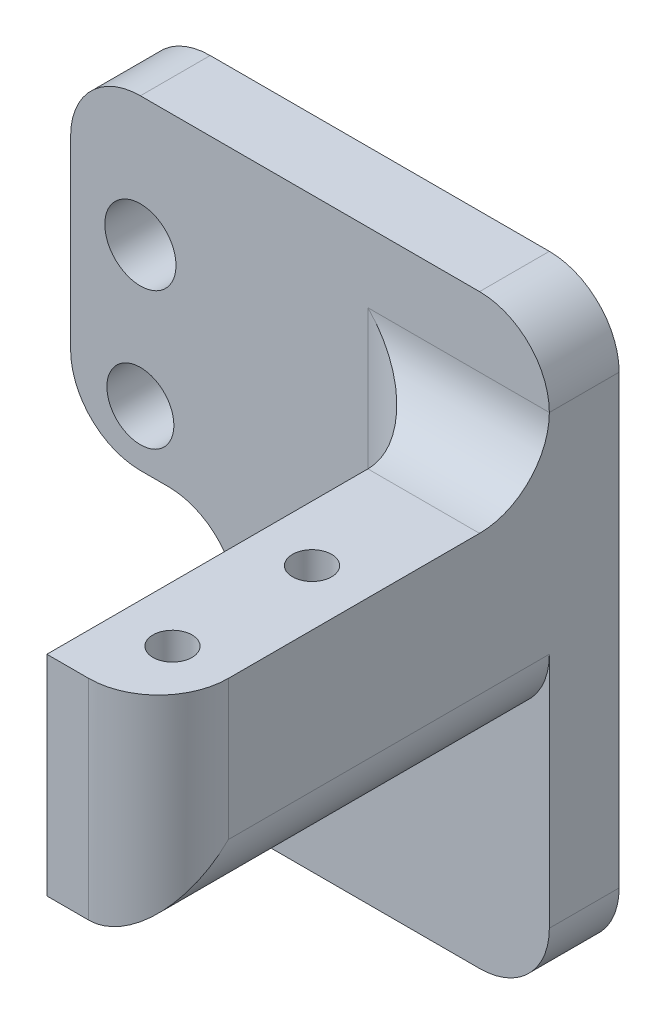
ISO-10303-21;
HEADER;
FILE_DESCRIPTION(('STEP AP214'),'2;1');
FILE_NAME('part.step','',(''),(''),'','','');
FILE_SCHEMA(('AUTOMOTIVE_DESIGN { 1 0 10303 214 1 1 1 1 }'));
ENDSEC;
DATA;
#1=APPLICATION_CONTEXT('core data for automotive mechanical design processes');
#2=APPLICATION_PROTOCOL_DEFINITION('international standard','automotive_design',2000,#1);
#3=PRODUCT_CONTEXT('',#1,'mechanical');
#4=PRODUCT('Part','Part','',(#3));
#5=PRODUCT_RELATED_PRODUCT_CATEGORY('part','',(#4));
#6=PRODUCT_DEFINITION_FORMATION('','',#4);
#7=PRODUCT_DEFINITION_CONTEXT('part definition',#1,'design');
#8=PRODUCT_DEFINITION('design','',#6,#7);
#9=PRODUCT_DEFINITION_SHAPE('','',#8);
#10=(LENGTH_UNIT() NAMED_UNIT(*) SI_UNIT(.MILLI.,.METRE.));
#11=(NAMED_UNIT(*) PLANE_ANGLE_UNIT() SI_UNIT($,.RADIAN.));
#12=(NAMED_UNIT(*) SI_UNIT($,.STERADIAN.) SOLID_ANGLE_UNIT());
#13=UNCERTAINTY_MEASURE_WITH_UNIT(LENGTH_MEASURE(1.E-05),#10,'distance_accuracy_value','');
#14=(GEOMETRIC_REPRESENTATION_CONTEXT(3) GLOBAL_UNCERTAINTY_ASSIGNED_CONTEXT((#13)) GLOBAL_UNIT_ASSIGNED_CONTEXT((#10,
#11,#12)) REPRESENTATION_CONTEXT('',''));
#15=CARTESIAN_POINT('',(0.,0.,0.));
#16=DIRECTION('',(0.,0.,1.));
#17=DIRECTION('',(1.,0.,0.));
#18=AXIS2_PLACEMENT_3D('',#15,#16,#17);
#19=CARTESIAN_POINT('',(4.,3.5,22.));
#20=DIRECTION('',(-1.,0.,0.));
#21=DIRECTION('',(0.,0.,1.));
#22=AXIS2_PLACEMENT_3D('',#19,#20,#21);
#23=PLANE('',#22);
#24=DIRECTION('',(0.,-1.,0.));
#25=VECTOR('',#24,1.);
#26=CARTESIAN_POINT('',(4.,0.,-6.));
#27=LINE('',#26,#25);
#28=CARTESIAN_POINT('',(4.,8.5,-6.));
#29=VERTEX_POINT('',#28);
#30=CARTESIAN_POINT('',(4.,-8.50000000000001,-6.));
#31=VERTEX_POINT('',#30);
#32=EDGE_CURVE('E328',#29,#31,#27,.T.);
#33=ORIENTED_EDGE('',*,*,#32,.T.);
#34=DIRECTION('',(0.,0.,1.));
#35=VECTOR('',#34,1.);
#36=CARTESIAN_POINT('',(4.,-8.50000000000001,22.));
#37=LINE('',#36,#35);
#38=CARTESIAN_POINT('',(4.,-8.50000000000001,-11.));
#39=VERTEX_POINT('',#38);
#40=EDGE_CURVE('E269',#31,#39,#37,.F.);
#41=ORIENTED_EDGE('',*,*,#40,.T.);
#42=DIRECTION('',(0.,-1.,0.));
#43=VECTOR('',#42,1.);
#44=CARTESIAN_POINT('',(4.,0.,-11.));
#45=LINE('',#44,#43);
#46=CARTESIAN_POINT('',(4.,23.5,-11.));
#47=VERTEX_POINT('',#46);
#48=EDGE_CURVE('E374',#47,#39,#45,.T.);
#49=ORIENTED_EDGE('',*,*,#48,.F.);
#50=DIRECTION('',(0.,0.,-1.));
#51=VECTOR('',#50,1.);
#52=CARTESIAN_POINT('',(4.,23.5,22.));
#53=LINE('',#52,#51);
#54=CARTESIAN_POINT('',(4.,23.5,-6.));
#55=VERTEX_POINT('',#54);
#56=EDGE_CURVE('E262',#47,#55,#53,.F.);
#57=ORIENTED_EDGE('',*,*,#56,.T.);
#58=CARTESIAN_POINT('',(4.,23.5,-1.));
#59=DIRECTION('',(-1.,0.,0.));
#60=DIRECTION('',(0.,0.,1.));
#61=AXIS2_PLACEMENT_3D('',#58,#59,#60);
#62=CIRCLE('',#61,5.);
#63=CARTESIAN_POINT('',(4.,18.5,-1.));
#64=VERTEX_POINT('',#63);
#65=EDGE_CURVE('E298',#55,#64,#62,.T.);
#66=ORIENTED_EDGE('',*,*,#65,.T.);
#67=DIRECTION('',(0.,0.,-1.));
#68=VECTOR('',#67,1.);
#69=CARTESIAN_POINT('',(4.,18.5,22.));
#70=LINE('',#69,#68);
#71=CARTESIAN_POINT('',(4.,18.5,17.));
#72=VERTEX_POINT('',#71);
#73=EDGE_CURVE('E207',#72,#64,#70,.T.);
#74=ORIENTED_EDGE('',*,*,#73,.F.);
#75=DIRECTION('',(0.,1.,0.));
#76=VECTOR('',#75,1.);
#77=CARTESIAN_POINT('',(4.,3.5,17.));
#78=LINE('',#77,#76);
#79=CARTESIAN_POINT('',(4.,8.5,17.));
#80=VERTEX_POINT('',#79);
#81=EDGE_CURVE('E267',#72,#80,#78,.F.);
#82=ORIENTED_EDGE('',*,*,#81,.T.);
#83=DIRECTION('',(0.,0.,-1.));
#84=VECTOR('',#83,1.);
#85=CARTESIAN_POINT('',(4.,8.5,22.));
#86=LINE('',#85,#84);
#87=EDGE_CURVE('E264',#80,#29,#86,.T.);
#88=ORIENTED_EDGE('',*,*,#87,.T.);
#89=EDGE_LOOP('',(#33,#41,#49,#57,#66,#74,#82,#88));
#90=FACE_BOUND('',#89,.T.);
#91=ADVANCED_FACE('F34',(#90),#23,.F.);
#92=CARTESIAN_POINT('',(-4.,18.5,22.));
#93=DIRECTION('',(0.,-1.,0.));
#94=DIRECTION('',(0.,0.,-1.));
#95=AXIS2_PLACEMENT_3D('',#92,#93,#94);
#96=PLANE('',#95);
#97=CARTESIAN_POINT('',(0.,18.5,17.));
#98=DIRECTION('',(0.,-1.,0.));
#99=DIRECTION('',(0.,0.,-1.));
#100=AXIS2_PLACEMENT_3D('',#97,#98,#99);
#101=CIRCLE('',#100,1.4);
#102=CARTESIAN_POINT('',(0.,18.5,15.6));
#103=VERTEX_POINT('',#102);
#104=EDGE_CURVE('E402',#103,#103,#101,.T.);
#105=ORIENTED_EDGE('',*,*,#104,.T.);
#106=EDGE_LOOP('',(#105));
#107=FACE_BOUND('',#106,.T.);
#108=CARTESIAN_POINT('',(0.,18.5,7.));
#109=DIRECTION('',(0.,-1.,0.));
#110=DIRECTION('',(0.,0.,-1.));
#111=AXIS2_PLACEMENT_3D('',#108,#109,#110);
#112=CIRCLE('',#111,1.4);
#113=CARTESIAN_POINT('',(0.,18.5,5.6));
#114=VERTEX_POINT('',#113);
#115=EDGE_CURVE('E399',#114,#114,#112,.T.);
#116=ORIENTED_EDGE('',*,*,#115,.T.);
#117=EDGE_LOOP('',(#116));
#118=FACE_BOUND('',#117,.T.);
#119=ORIENTED_EDGE('',*,*,#73,.T.);
#120=DIRECTION('',(-1.,0.,0.));
#121=VECTOR('',#120,1.);
#122=CARTESIAN_POINT('',(-4.,18.5,-1.));
#123=LINE('',#122,#121);
#124=CARTESIAN_POINT('',(-4.,18.5,-1.));
#125=VERTEX_POINT('',#124);
#126=EDGE_CURVE('E206',#64,#125,#123,.T.);
#127=ORIENTED_EDGE('',*,*,#126,.T.);
#128=DIRECTION('',(0.,0.,-1.));
#129=VECTOR('',#128,1.);
#130=CARTESIAN_POINT('',(-4.,18.5,22.));
#131=LINE('',#130,#129);
#132=CARTESIAN_POINT('',(-4.,18.5,22.));
#133=VERTEX_POINT('',#132);
#134=EDGE_CURVE('E202',#133,#125,#131,.T.);
#135=ORIENTED_EDGE('',*,*,#134,.F.);
#136=DIRECTION('',(-1.,0.,0.));
#137=VECTOR('',#136,1.);
#138=CARTESIAN_POINT('',(-4.,18.5,22.));
#139=LINE('',#138,#137);
#140=CARTESIAN_POINT('',(-1.,18.5,22.));
#141=VERTEX_POINT('',#140);
#142=EDGE_CURVE('E191',#141,#133,#139,.T.);
#143=ORIENTED_EDGE('',*,*,#142,.F.);
#144=CARTESIAN_POINT('',(-1.,18.5,17.));
#145=DIRECTION('',(0.,-1.,0.));
#146=DIRECTION('',(0.,0.,-1.));
#147=AXIS2_PLACEMENT_3D('',#144,#145,#146);
#148=CIRCLE('',#147,5.);
#149=EDGE_CURVE('E271',#141,#72,#148,.F.);
#150=ORIENTED_EDGE('',*,*,#149,.T.);
#151=EDGE_LOOP('',(#119,#127,#135,#143,#150));
#152=FACE_BOUND('',#151,.T.);
#153=ADVANCED_FACE('F204',(#107,#118,#152),#96,.F.);
#154=CARTESIAN_POINT('',(-4.,3.5,22.));
#155=DIRECTION('',(1.,0.,0.));
#156=DIRECTION('',(0.,0.,-1.));
#157=AXIS2_PLACEMENT_3D('',#154,#155,#156);
#158=PLANE('',#157);
#159=ORIENTED_EDGE('',*,*,#134,.T.);
#160=DIRECTION('',(0.,-1.,0.));
#161=VECTOR('',#160,1.);
#162=CARTESIAN_POINT('',(-4.,3.5,-1.));
#163=LINE('',#162,#161);
#164=CARTESIAN_POINT('',(-4.,3.5,-1.));
#165=VERTEX_POINT('',#164);
#166=EDGE_CURVE('E51',#125,#165,#163,.T.);
#167=ORIENTED_EDGE('',*,*,#166,.T.);
#168=DIRECTION('',(0.,0.,-1.));
#169=VECTOR('',#168,1.);
#170=CARTESIAN_POINT('',(-4.,3.5,22.));
#171=LINE('',#170,#169);
#172=CARTESIAN_POINT('',(-4.,3.5,22.));
#173=VERTEX_POINT('',#172);
#174=EDGE_CURVE('E208',#173,#165,#171,.T.);
#175=ORIENTED_EDGE('',*,*,#174,.F.);
#176=DIRECTION('',(0.,-1.,0.));
#177=VECTOR('',#176,1.);
#178=CARTESIAN_POINT('',(-4.,3.5,22.));
#179=LINE('',#178,#177);
#180=EDGE_CURVE('E195',#133,#173,#179,.T.);
#181=ORIENTED_EDGE('',*,*,#180,.F.);
#182=EDGE_LOOP('',(#159,#167,#175,#181));
#183=FACE_BOUND('',#182,.T.);
#184=ADVANCED_FACE('F210',(#183),#158,.F.);
#185=CARTESIAN_POINT('',(-4.,3.5,22.));
#186=DIRECTION('',(0.,1.,0.));
#187=DIRECTION('',(0.,0.,1.));
#188=AXIS2_PLACEMENT_3D('',#185,#186,#187);
#189=PLANE('',#188);
#190=DIRECTION('',(1.,0.,0.));
#191=VECTOR('',#190,1.);
#192=CARTESIAN_POINT('',(4.,3.5,-6.));
#193=LINE('',#192,#191);
#194=CARTESIAN_POINT('',(-9.,3.5,-6.));
#195=VERTEX_POINT('',#194);
#196=CARTESIAN_POINT('',(-1.,3.5,-6.));
#197=VERTEX_POINT('',#196);
#198=EDGE_CURVE('E382',#195,#197,#193,.T.);
#199=ORIENTED_EDGE('',*,*,#198,.T.);
#200=DIRECTION('',(0.,0.,-1.));
#201=VECTOR('',#200,1.);
#202=CARTESIAN_POINT('',(-1.,3.5,22.));
#203=LINE('',#202,#201);
#204=CARTESIAN_POINT('',(-1.,3.5,22.));
#205=VERTEX_POINT('',#204);
#206=EDGE_CURVE('E59',#197,#205,#203,.F.);
#207=ORIENTED_EDGE('',*,*,#206,.T.);
#208=DIRECTION('',(1.,0.,0.));
#209=VECTOR('',#208,1.);
#210=CARTESIAN_POINT('',(-4.,3.5,22.));
#211=LINE('',#210,#209);
#212=EDGE_CURVE('E211',#173,#205,#211,.T.);
#213=ORIENTED_EDGE('',*,*,#212,.F.);
#214=ORIENTED_EDGE('',*,*,#174,.T.);
#215=CARTESIAN_POINT('',(-9.,3.5,-1.));
#216=DIRECTION('',(0.,1.,0.));
#217=DIRECTION('',(0.,0.,1.));
#218=AXIS2_PLACEMENT_3D('',#215,#216,#217);
#219=CIRCLE('',#218,5.);
#220=EDGE_CURVE('E302',#165,#195,#219,.T.);
#221=ORIENTED_EDGE('',*,*,#220,.T.);
#222=EDGE_LOOP('',(#199,#207,#213,#214,#221));
#223=FACE_BOUND('',#222,.T.);
#224=ADVANCED_FACE('F423',(#223),#189,.F.);
#225=CARTESIAN_POINT('',(0.,0.,22.));
#226=DIRECTION('',(0.,0.,-1.));
#227=DIRECTION('',(-1.,0.,0.));
#228=AXIS2_PLACEMENT_3D('',#225,#226,#227);
#229=PLANE('',#228);
#230=ORIENTED_EDGE('',*,*,#212,.T.);
#231=DIRECTION('',(0.,1.,0.));
#232=VECTOR('',#231,1.);
#233=CARTESIAN_POINT('',(-1.,0.,22.));
#234=LINE('',#233,#232);
#235=EDGE_CURVE('E197',#205,#141,#234,.T.);
#236=ORIENTED_EDGE('',*,*,#235,.T.);
#237=ORIENTED_EDGE('',*,*,#142,.T.);
#238=ORIENTED_EDGE('',*,*,#180,.T.);
#239=EDGE_LOOP('',(#230,#236,#237,#238));
#240=FACE_BOUND('',#239,.T.);
#241=ADVANCED_FACE('F193',(#240),#229,.F.);
#242=CARTESIAN_POINT('',(0.,8.49999999999999,7.));
#243=DIRECTION('',(0.,1.,0.));
#244=DIRECTION('',(0.,0.,1.));
#245=AXIS2_PLACEMENT_3D('',#242,#243,#244);
#246=CYLINDRICAL_SURFACE('',#245,1.4);
#247=CARTESIAN_POINT('',(0.,8.49999999999999,7.));
#248=DIRECTION('',(0.,-1.,0.));
#249=DIRECTION('',(0.,0.,-1.));
#250=AXIS2_PLACEMENT_3D('',#247,#248,#249);
#251=CIRCLE('',#250,1.4);
#252=CARTESIAN_POINT('',(0.,8.49999999999999,5.6));
#253=VERTEX_POINT('',#252);
#254=EDGE_CURVE('E405',#253,#253,#251,.T.);
#255=ORIENTED_EDGE('',*,*,#254,.T.);
#256=EDGE_LOOP('',(#255));
#257=FACE_BOUND('',#256,.T.);
#258=ORIENTED_EDGE('',*,*,#115,.F.);
#259=EDGE_LOOP('',(#258));
#260=FACE_BOUND('',#259,.T.);
#261=ADVANCED_FACE('F411',(#257,#260),#246,.F.);
#262=CARTESIAN_POINT('',(0.,8.49999999999999,7.));
#263=DIRECTION('',(0.,-1.,0.));
#264=DIRECTION('',(0.,0.,-1.));
#265=AXIS2_PLACEMENT_3D('',#262,#263,#264);
#266=PLANE('',#265);
#267=ORIENTED_EDGE('',*,*,#254,.F.);
#268=EDGE_LOOP('',(#267));
#269=FACE_BOUND('',#268,.T.);
#270=ADVANCED_FACE('F413',(#269),#266,.F.);
#271=CARTESIAN_POINT('',(0.,8.49999999999999,17.));
#272=DIRECTION('',(0.,1.,0.));
#273=DIRECTION('',(0.,0.,1.));
#274=AXIS2_PLACEMENT_3D('',#271,#272,#273);
#275=CYLINDRICAL_SURFACE('',#274,1.4);
#276=CARTESIAN_POINT('',(0.,8.49999999999999,17.));
#277=DIRECTION('',(0.,-1.,0.));
#278=DIRECTION('',(0.,0.,-1.));
#279=AXIS2_PLACEMENT_3D('',#276,#277,#278);
#280=CIRCLE('',#279,1.4);
#281=CARTESIAN_POINT('',(0.,8.49999999999999,15.6));
#282=VERTEX_POINT('',#281);
#283=EDGE_CURVE('E199',#282,#282,#280,.T.);
#284=ORIENTED_EDGE('',*,*,#283,.T.);
#285=EDGE_LOOP('',(#284));
#286=FACE_BOUND('',#285,.T.);
#287=ORIENTED_EDGE('',*,*,#104,.F.);
#288=EDGE_LOOP('',(#287));
#289=FACE_BOUND('',#288,.T.);
#290=ADVANCED_FACE('F420',(#286,#289),#275,.F.);
#291=CARTESIAN_POINT('',(0.,8.49999999999999,17.));
#292=DIRECTION('',(0.,-1.,0.));
#293=DIRECTION('',(0.,0.,-1.));
#294=AXIS2_PLACEMENT_3D('',#291,#292,#293);
#295=PLANE('',#294);
#296=ORIENTED_EDGE('',*,*,#283,.F.);
#297=EDGE_LOOP('',(#296));
#298=FACE_BOUND('',#297,.T.);
#299=ADVANCED_FACE('F566',(#298),#295,.F.);
#300=CARTESIAN_POINT('',(0.,0.,-6.));
#301=DIRECTION('',(0.,0.,1.));
#302=DIRECTION('',(1.,0.,0.));
#303=AXIS2_PLACEMENT_3D('',#300,#301,#302);
#304=PLANE('',#303);
#305=CARTESIAN_POINT('',(-25.3,19.25,-6.));
#306=DIRECTION('',(0.,0.,1.));
#307=DIRECTION('',(1.,0.,0.));
#308=AXIS2_PLACEMENT_3D('',#305,#306,#307);
#309=CIRCLE('',#308,2.55);
#310=CARTESIAN_POINT('',(-22.75,19.25,-6.));
#311=VERTEX_POINT('',#310);
#312=EDGE_CURVE('E356',#311,#311,#309,.T.);
#313=ORIENTED_EDGE('',*,*,#312,.F.);
#314=EDGE_LOOP('',(#313));
#315=FACE_BOUND('',#314,.T.);
#316=CARTESIAN_POINT('',(-25.3,9.25,-6.));
#317=DIRECTION('',(0.,0.,1.));
#318=DIRECTION('',(1.,0.,0.));
#319=AXIS2_PLACEMENT_3D('',#316,#317,#318);
#320=CIRCLE('',#319,2.4);
#321=CARTESIAN_POINT('',(-22.9,9.25,-6.));
#322=VERTEX_POINT('',#321);
#323=EDGE_CURVE('E776',#322,#322,#320,.T.);
#324=ORIENTED_EDGE('',*,*,#323,.F.);
#325=EDGE_LOOP('',(#324));
#326=FACE_BOUND('',#325,.T.);
#327=DIRECTION('',(0.,1.,0.));
#328=VECTOR('',#327,1.);
#329=CARTESIAN_POINT('',(-30.3,0.,-6.));
#330=LINE('',#329,#328);
#331=CARTESIAN_POINT('',(-30.3,-11.5,-6.));
#332=VERTEX_POINT('',#331);
#333=CARTESIAN_POINT('',(-30.3,-8.75000000000001,-6.));
#334=VERTEX_POINT('',#333);
#335=EDGE_CURVE('E365',#332,#334,#330,.T.);
#336=ORIENTED_EDGE('',*,*,#335,.F.);
#337=CARTESIAN_POINT('',(-28.3,-11.5,-6.));
#338=DIRECTION('',(0.,0.,1.));
#339=DIRECTION('',(1.,0.,0.));
#340=AXIS2_PLACEMENT_3D('',#337,#338,#339);
#341=CIRCLE('',#340,2.);
#342=CARTESIAN_POINT('',(-28.3,-13.5,-6.));
#343=VERTEX_POINT('',#342);
#344=EDGE_CURVE('E238',#332,#343,#341,.T.);
#345=ORIENTED_EDGE('',*,*,#344,.T.);
#346=DIRECTION('',(-1.,0.,0.));
#347=VECTOR('',#346,1.);
#348=CARTESIAN_POINT('',(0.,-13.5,-6.));
#349=LINE('',#348,#347);
#350=CARTESIAN_POINT('',(-1.,-13.5,-6.));
#351=VERTEX_POINT('',#350);
#352=EDGE_CURVE('E393',#351,#343,#349,.T.);
#353=ORIENTED_EDGE('',*,*,#352,.F.);
#354=CARTESIAN_POINT('',(-1.,-8.50000000000001,-6.));
#355=DIRECTION('',(0.,0.,1.));
#356=DIRECTION('',(1.,0.,0.));
#357=AXIS2_PLACEMENT_3D('',#354,#355,#356);
#358=CIRCLE('',#357,5.);
#359=EDGE_CURVE('E234',#351,#31,#358,.T.);
#360=ORIENTED_EDGE('',*,*,#359,.T.);
#361=ORIENTED_EDGE('',*,*,#32,.F.);
#362=CARTESIAN_POINT('',(-1.,8.5,-6.));
#363=DIRECTION('',(0.,0.,1.));
#364=DIRECTION('',(1.,0.,0.));
#365=AXIS2_PLACEMENT_3D('',#362,#363,#364);
#366=CIRCLE('',#365,5.);
#367=EDGE_CURVE('E300',#29,#197,#366,.F.);
#368=ORIENTED_EDGE('',*,*,#367,.T.);
#369=ORIENTED_EDGE('',*,*,#198,.F.);
#370=DIRECTION('',(0.,-1.,0.));
#371=VECTOR('',#370,1.);
#372=CARTESIAN_POINT('',(-9.,0.,-6.));
#373=LINE('',#372,#371);
#374=CARTESIAN_POINT('',(-9.,23.5,-6.));
#375=VERTEX_POINT('',#374);
#376=EDGE_CURVE('E225',#195,#375,#373,.F.);
#377=ORIENTED_EDGE('',*,*,#376,.T.);
#378=DIRECTION('',(-1.,0.,0.));
#379=VECTOR('',#378,1.);
#380=CARTESIAN_POINT('',(0.,23.5,-6.));
#381=LINE('',#380,#379);
#382=EDGE_CURVE('E227',#375,#55,#381,.F.);
#383=ORIENTED_EDGE('',*,*,#382,.T.);
#384=CARTESIAN_POINT('',(-1.,23.5,-6.));
#385=DIRECTION('',(0.,0.,1.));
#386=DIRECTION('',(1.,0.,0.));
#387=AXIS2_PLACEMENT_3D('',#384,#385,#386);
#388=CIRCLE('',#387,5.);
#389=CARTESIAN_POINT('',(-1.,28.5,-6.));
#390=VERTEX_POINT('',#389);
#391=EDGE_CURVE('E230',#55,#390,#388,.T.);
#392=ORIENTED_EDGE('',*,*,#391,.T.);
#393=DIRECTION('',(-1.,0.,0.));
#394=VECTOR('',#393,1.);
#395=CARTESIAN_POINT('',(0.,28.5,-6.));
#396=LINE('',#395,#394);
#397=CARTESIAN_POINT('',(-25.3,28.5,-6.));
#398=VERTEX_POINT('',#397);
#399=EDGE_CURVE('E343',#390,#398,#396,.T.);
#400=ORIENTED_EDGE('',*,*,#399,.T.);
#401=CARTESIAN_POINT('',(-25.3,23.5,-6.));
#402=DIRECTION('',(0.,0.,1.));
#403=DIRECTION('',(1.,0.,0.));
#404=AXIS2_PLACEMENT_3D('',#401,#402,#403);
#405=CIRCLE('',#404,5.);
#406=CARTESIAN_POINT('',(-30.3,23.5,-6.));
#407=VERTEX_POINT('',#406);
#408=EDGE_CURVE('E232',#398,#407,#405,.T.);
#409=ORIENTED_EDGE('',*,*,#408,.T.);
#410=DIRECTION('',(0.,1.,0.));
#411=VECTOR('',#410,1.);
#412=CARTESIAN_POINT('',(-30.3,0.,-6.));
#413=LINE('',#412,#411);
#414=CARTESIAN_POINT('',(-30.3,10.25,-6.));
#415=VERTEX_POINT('',#414);
#416=EDGE_CURVE('E389',#415,#407,#413,.T.);
#417=ORIENTED_EDGE('',*,*,#416,.F.);
#418=CARTESIAN_POINT('',(-25.3,10.25,-6.));
#419=DIRECTION('',(0.,0.,1.));
#420=DIRECTION('',(1.,0.,0.));
#421=AXIS2_PLACEMENT_3D('',#418,#419,#420);
#422=CIRCLE('',#421,5.);
#423=CARTESIAN_POINT('',(-25.3,5.25,-6.));
#424=VERTEX_POINT('',#423);
#425=EDGE_CURVE('E223',#415,#424,#422,.T.);
#426=ORIENTED_EDGE('',*,*,#425,.T.);
#427=DIRECTION('',(-1.,0.,0.));
#428=VECTOR('',#427,1.);
#429=CARTESIAN_POINT('',(0.,5.25,-6.));
#430=LINE('',#429,#428);
#431=CARTESIAN_POINT('',(-23.3,5.25,-6.));
#432=VERTEX_POINT('',#431);
#433=EDGE_CURVE('E386',#432,#424,#430,.T.);
#434=ORIENTED_EDGE('',*,*,#433,.F.);
#435=CARTESIAN_POINT('',(-23.3,0.249999999999996,-6.));
#436=DIRECTION('',(0.,0.,1.));
#437=DIRECTION('',(1.,0.,0.));
#438=AXIS2_PLACEMENT_3D('',#435,#436,#437);
#439=CIRCLE('',#438,5.);
#440=CARTESIAN_POINT('',(-18.3,0.249999999999996,-6.));
#441=VERTEX_POINT('',#440);
#442=EDGE_CURVE('E305',#432,#441,#439,.F.);
#443=ORIENTED_EDGE('',*,*,#442,.T.);
#444=DIRECTION('',(0.,1.,0.));
#445=VECTOR('',#444,1.);
#446=CARTESIAN_POINT('',(-18.3,0.,-6.));
#447=LINE('',#446,#445);
#448=CARTESIAN_POINT('',(-18.3,-1.75000000000001,-6.));
#449=VERTEX_POINT('',#448);
#450=EDGE_CURVE('E354',#449,#441,#447,.T.);
#451=ORIENTED_EDGE('',*,*,#450,.F.);
#452=CARTESIAN_POINT('',(-23.3,-1.75000000000001,-6.));
#453=DIRECTION('',(0.,0.,1.));
#454=DIRECTION('',(1.,0.,0.));
#455=AXIS2_PLACEMENT_3D('',#452,#453,#454);
#456=CIRCLE('',#455,5.);
#457=CARTESIAN_POINT('',(-23.3,-6.75000000000001,-6.));
#458=VERTEX_POINT('',#457);
#459=EDGE_CURVE('E43',#449,#458,#456,.F.);
#460=ORIENTED_EDGE('',*,*,#459,.T.);
#461=DIRECTION('',(1.,0.,0.));
#462=VECTOR('',#461,1.);
#463=CARTESIAN_POINT('',(0.,-6.75000000000001,-6.));
#464=LINE('',#463,#462);
#465=CARTESIAN_POINT('',(-28.3,-6.75000000000001,-6.));
#466=VERTEX_POINT('',#465);
#467=EDGE_CURVE('E350',#466,#458,#464,.T.);
#468=ORIENTED_EDGE('',*,*,#467,.F.);
#469=CARTESIAN_POINT('',(-28.3,-8.75000000000001,-6.));
#470=DIRECTION('',(0.,0.,1.));
#471=DIRECTION('',(1.,0.,0.));
#472=AXIS2_PLACEMENT_3D('',#469,#470,#471);
#473=CIRCLE('',#472,2.);
#474=EDGE_CURVE('E236',#466,#334,#473,.T.);
#475=ORIENTED_EDGE('',*,*,#474,.T.);
#476=EDGE_LOOP('',(#336,#345,#353,#360,#361,#368,#369,#377,#383,#392,#400,#409,#417,#426,#434,
#443,#451,#460,#468,#475));
#477=FACE_BOUND('',#476,.T.);
#478=ADVANCED_FACE('F342',(#315,#326,#477),#304,.T.);
#479=CARTESIAN_POINT('',(0.,-6.75000000000001,-11.));
#480=DIRECTION('',(0.,-1.,0.));
#481=DIRECTION('',(1.,0.,0.));
#482=AXIS2_PLACEMENT_3D('',#479,#480,#481);
#483=PLANE('',#482);
#484=DIRECTION('',(1.,0.,0.));
#485=VECTOR('',#484,1.);
#486=CARTESIAN_POINT('',(0.,-6.75000000000001,-11.));
#487=LINE('',#486,#485);
#488=CARTESIAN_POINT('',(-28.3,-6.75000000000001,-11.));
#489=VERTEX_POINT('',#488);
#490=CARTESIAN_POINT('',(-23.3,-6.75000000000001,-11.));
#491=VERTEX_POINT('',#490);
#492=EDGE_CURVE('E361',#489,#491,#487,.T.);
#493=ORIENTED_EDGE('',*,*,#492,.F.);
#494=DIRECTION('',(0.,0.,1.));
#495=VECTOR('',#494,1.);
#496=CARTESIAN_POINT('',(-28.3,-6.75000000000001,-11.));
#497=LINE('',#496,#495);
#498=EDGE_CURVE('E259',#489,#466,#497,.T.);
#499=ORIENTED_EDGE('',*,*,#498,.T.);
#500=ORIENTED_EDGE('',*,*,#467,.T.);
#501=DIRECTION('',(0.,0.,1.));
#502=VECTOR('',#501,1.);
#503=CARTESIAN_POINT('',(-23.3,-6.75000000000001,-11.));
#504=LINE('',#503,#502);
#505=EDGE_CURVE('E257',#458,#491,#504,.F.);
#506=ORIENTED_EDGE('',*,*,#505,.T.);
#507=EDGE_LOOP('',(#493,#499,#500,#506));
#508=FACE_BOUND('',#507,.T.);
#509=ADVANCED_FACE('F510',(#508),#483,.F.);
#510=CARTESIAN_POINT('',(-18.3,0.,-11.));
#511=DIRECTION('',(1.,0.,0.));
#512=DIRECTION('',(0.,0.,-1.));
#513=AXIS2_PLACEMENT_3D('',#510,#511,#512);
#514=PLANE('',#513);
#515=ORIENTED_EDGE('',*,*,#450,.T.);
#516=DIRECTION('',(0.,0.,1.));
#517=VECTOR('',#516,1.);
#518=CARTESIAN_POINT('',(-18.3,0.249999999999996,-11.));
#519=LINE('',#518,#517);
#520=CARTESIAN_POINT('',(-18.3,0.249999999999996,-11.));
#521=VERTEX_POINT('',#520);
#522=EDGE_CURVE('E296',#441,#521,#519,.F.);
#523=ORIENTED_EDGE('',*,*,#522,.T.);
#524=DIRECTION('',(0.,1.,0.));
#525=VECTOR('',#524,1.);
#526=CARTESIAN_POINT('',(-18.3,0.,-11.));
#527=LINE('',#526,#525);
#528=CARTESIAN_POINT('',(-18.3,-1.75000000000001,-11.));
#529=VERTEX_POINT('',#528);
#530=EDGE_CURVE('E364',#529,#521,#527,.T.);
#531=ORIENTED_EDGE('',*,*,#530,.F.);
#532=DIRECTION('',(0.,0.,1.));
#533=VECTOR('',#532,1.);
#534=CARTESIAN_POINT('',(-18.3,-1.75000000000001,-6.));
#535=LINE('',#534,#533);
#536=EDGE_CURVE('E293',#529,#449,#535,.T.);
#537=ORIENTED_EDGE('',*,*,#536,.T.);
#538=EDGE_LOOP('',(#515,#523,#531,#537));
#539=FACE_BOUND('',#538,.T.);
#540=ADVANCED_FACE('F515',(#539),#514,.F.);
#541=CARTESIAN_POINT('',(0.,5.25,-11.));
#542=DIRECTION('',(0.,1.,0.));
#543=DIRECTION('',(0.,0.,1.));
#544=AXIS2_PLACEMENT_3D('',#541,#542,#543);
#545=PLANE('',#544);
#546=ORIENTED_EDGE('',*,*,#433,.T.);
#547=DIRECTION('',(0.,0.,1.));
#548=VECTOR('',#547,1.);
#549=CARTESIAN_POINT('',(-25.3,5.25,-11.));
#550=LINE('',#549,#548);
#551=CARTESIAN_POINT('',(-25.3,5.25,-11.));
#552=VERTEX_POINT('',#551);
#553=EDGE_CURVE('E291',#424,#552,#550,.F.);
#554=ORIENTED_EDGE('',*,*,#553,.T.);
#555=DIRECTION('',(-1.,0.,0.));
#556=VECTOR('',#555,1.);
#557=CARTESIAN_POINT('',(0.,5.25,-11.));
#558=LINE('',#557,#556);
#559=CARTESIAN_POINT('',(-23.3,5.25,-11.));
#560=VERTEX_POINT('',#559);
#561=EDGE_CURVE('E368',#560,#552,#558,.T.);
#562=ORIENTED_EDGE('',*,*,#561,.F.);
#563=DIRECTION('',(0.,0.,1.));
#564=VECTOR('',#563,1.);
#565=CARTESIAN_POINT('',(-23.3,5.25,-6.));
#566=LINE('',#565,#564);
#567=EDGE_CURVE('E288',#560,#432,#566,.T.);
#568=ORIENTED_EDGE('',*,*,#567,.T.);
#569=EDGE_LOOP('',(#546,#554,#562,#568));
#570=FACE_BOUND('',#569,.T.);
#571=ADVANCED_FACE('F482',(#570),#545,.F.);
#572=CARTESIAN_POINT('',(-30.3,0.,-11.));
#573=DIRECTION('',(1.,0.,0.));
#574=DIRECTION('',(0.,0.,-1.));
#575=AXIS2_PLACEMENT_3D('',#572,#573,#574);
#576=PLANE('',#575);
#577=ORIENTED_EDGE('',*,*,#416,.T.);
#578=DIRECTION('',(0.,0.,-1.));
#579=VECTOR('',#578,1.);
#580=CARTESIAN_POINT('',(-30.3,23.5,-11.));
#581=LINE('',#580,#579);
#582=CARTESIAN_POINT('',(-30.3,23.5,-11.));
#583=VERTEX_POINT('',#582);
#584=EDGE_CURVE('E277',#407,#583,#581,.T.);
#585=ORIENTED_EDGE('',*,*,#584,.T.);
#586=DIRECTION('',(0.,1.,0.));
#587=VECTOR('',#586,1.);
#588=CARTESIAN_POINT('',(-30.3,0.,-11.));
#589=LINE('',#588,#587);
#590=CARTESIAN_POINT('',(-30.3,10.25,-11.));
#591=VERTEX_POINT('',#590);
#592=EDGE_CURVE('E371',#591,#583,#589,.T.);
#593=ORIENTED_EDGE('',*,*,#592,.F.);
#594=DIRECTION('',(0.,0.,1.));
#595=VECTOR('',#594,1.);
#596=CARTESIAN_POINT('',(-30.3,10.25,-11.));
#597=LINE('',#596,#595);
#598=EDGE_CURVE('E274',#591,#415,#597,.T.);
#599=ORIENTED_EDGE('',*,*,#598,.T.);
#600=EDGE_LOOP('',(#577,#585,#593,#599));
#601=FACE_BOUND('',#600,.T.);
#602=ADVANCED_FACE('F488',(#601),#576,.F.);
#603=CARTESIAN_POINT('',(0.,-13.5,-11.));
#604=DIRECTION('',(0.,1.,0.));
#605=DIRECTION('',(-1.,0.,0.));
#606=AXIS2_PLACEMENT_3D('',#603,#604,#605);
#607=PLANE('',#606);
#608=ORIENTED_EDGE('',*,*,#352,.T.);
#609=DIRECTION('',(0.,0.,1.));
#610=VECTOR('',#609,1.);
#611=CARTESIAN_POINT('',(-28.3,-13.5,-11.));
#612=LINE('',#611,#610);
#613=CARTESIAN_POINT('',(-28.3,-13.5,-11.));
#614=VERTEX_POINT('',#613);
#615=EDGE_CURVE('E243',#343,#614,#612,.F.);
#616=ORIENTED_EDGE('',*,*,#615,.T.);
#617=DIRECTION('',(-1.,0.,0.));
#618=VECTOR('',#617,1.);
#619=CARTESIAN_POINT('',(0.,-13.5,-11.));
#620=LINE('',#619,#618);
#621=CARTESIAN_POINT('',(-1.,-13.5,-11.));
#622=VERTEX_POINT('',#621);
#623=EDGE_CURVE('E377',#622,#614,#620,.T.);
#624=ORIENTED_EDGE('',*,*,#623,.F.);
#625=DIRECTION('',(0.,0.,1.));
#626=VECTOR('',#625,1.);
#627=CARTESIAN_POINT('',(-1.,-13.5,-11.));
#628=LINE('',#627,#626);
#629=EDGE_CURVE('E240',#622,#351,#628,.T.);
#630=ORIENTED_EDGE('',*,*,#629,.T.);
#631=EDGE_LOOP('',(#608,#616,#624,#630));
#632=FACE_BOUND('',#631,.T.);
#633=ADVANCED_FACE('F497',(#632),#607,.F.);
#634=CARTESIAN_POINT('',(-30.3,0.,-11.));
#635=DIRECTION('',(1.,0.,0.));
#636=DIRECTION('',(0.,0.,-1.));
#637=AXIS2_PLACEMENT_3D('',#634,#635,#636);
#638=PLANE('',#637);
#639=DIRECTION('',(0.,1.,0.));
#640=VECTOR('',#639,1.);
#641=CARTESIAN_POINT('',(-30.3,0.,-11.));
#642=LINE('',#641,#640);
#643=CARTESIAN_POINT('',(-30.3,-11.5,-11.));
#644=VERTEX_POINT('',#643);
#645=CARTESIAN_POINT('',(-30.3,-8.75000000000001,-11.));
#646=VERTEX_POINT('',#645);
#647=EDGE_CURVE('E380',#644,#646,#642,.T.);
#648=ORIENTED_EDGE('',*,*,#647,.F.);
#649=DIRECTION('',(0.,0.,1.));
#650=VECTOR('',#649,1.);
#651=CARTESIAN_POINT('',(-30.3,-11.5,-11.));
#652=LINE('',#651,#650);
#653=EDGE_CURVE('E220',#644,#332,#652,.T.);
#654=ORIENTED_EDGE('',*,*,#653,.T.);
#655=ORIENTED_EDGE('',*,*,#335,.T.);
#656=DIRECTION('',(0.,0.,1.));
#657=VECTOR('',#656,1.);
#658=CARTESIAN_POINT('',(-30.3,-8.75000000000001,-11.));
#659=LINE('',#658,#657);
#660=EDGE_CURVE('E218',#334,#646,#659,.F.);
#661=ORIENTED_EDGE('',*,*,#660,.T.);
#662=EDGE_LOOP('',(#648,#654,#655,#661));
#663=FACE_BOUND('',#662,.T.);
#664=ADVANCED_FACE('F504',(#663),#638,.F.);
#665=CARTESIAN_POINT('',(0.,0.,-11.));
#666=DIRECTION('',(0.,0.,1.));
#667=DIRECTION('',(1.,0.,0.));
#668=AXIS2_PLACEMENT_3D('',#665,#666,#667);
#669=PLANE('',#668);
#670=CARTESIAN_POINT('',(-25.3,19.25,-11.));
#671=DIRECTION('',(0.,0.,1.));
#672=DIRECTION('',(1.,0.,0.));
#673=AXIS2_PLACEMENT_3D('',#670,#671,#672);
#674=CIRCLE('',#673,2.55);
#675=CARTESIAN_POINT('',(-22.75,19.25,-11.));
#676=VERTEX_POINT('',#675);
#677=EDGE_CURVE('E315',#676,#676,#674,.T.);
#678=ORIENTED_EDGE('',*,*,#677,.T.);
#679=EDGE_LOOP('',(#678));
#680=FACE_BOUND('',#679,.T.);
#681=CARTESIAN_POINT('',(-25.3,9.25,-11.));
#682=DIRECTION('',(0.,0.,1.));
#683=DIRECTION('',(1.,0.,0.));
#684=AXIS2_PLACEMENT_3D('',#681,#682,#683);
#685=CIRCLE('',#684,2.4);
#686=CARTESIAN_POINT('',(-22.9,9.25,-11.));
#687=VERTEX_POINT('',#686);
#688=EDGE_CURVE('E310',#687,#687,#685,.T.);
#689=ORIENTED_EDGE('',*,*,#688,.T.);
#690=EDGE_LOOP('',(#689));
#691=FACE_BOUND('',#690,.T.);
#692=ORIENTED_EDGE('',*,*,#623,.T.);
#693=CARTESIAN_POINT('',(-28.3,-11.5,-11.));
#694=DIRECTION('',(0.,0.,1.));
#695=DIRECTION('',(1.,0.,0.));
#696=AXIS2_PLACEMENT_3D('',#693,#694,#695);
#697=CIRCLE('',#696,2.);
#698=EDGE_CURVE('E255',#614,#644,#697,.F.);
#699=ORIENTED_EDGE('',*,*,#698,.T.);
#700=ORIENTED_EDGE('',*,*,#647,.T.);
#701=CARTESIAN_POINT('',(-28.3,-8.75000000000001,-11.));
#702=DIRECTION('',(0.,0.,1.));
#703=DIRECTION('',(1.,0.,0.));
#704=AXIS2_PLACEMENT_3D('',#701,#702,#703);
#705=CIRCLE('',#704,2.);
#706=EDGE_CURVE('E253',#646,#489,#705,.F.);
#707=ORIENTED_EDGE('',*,*,#706,.T.);
#708=ORIENTED_EDGE('',*,*,#492,.T.);
#709=CARTESIAN_POINT('',(-23.3,-1.75000000000001,-11.));
#710=DIRECTION('',(0.,0.,1.));
#711=DIRECTION('',(1.,0.,0.));
#712=AXIS2_PLACEMENT_3D('',#709,#710,#711);
#713=CIRCLE('',#712,5.);
#714=EDGE_CURVE('E12',#491,#529,#713,.T.);
#715=ORIENTED_EDGE('',*,*,#714,.T.);
#716=ORIENTED_EDGE('',*,*,#530,.T.);
#717=CARTESIAN_POINT('',(-23.3,0.249999999999996,-11.));
#718=DIRECTION('',(0.,0.,1.));
#719=DIRECTION('',(1.,0.,0.));
#720=AXIS2_PLACEMENT_3D('',#717,#718,#719);
#721=CIRCLE('',#720,5.);
#722=EDGE_CURVE('E307',#521,#560,#721,.T.);
#723=ORIENTED_EDGE('',*,*,#722,.T.);
#724=ORIENTED_EDGE('',*,*,#561,.T.);
#725=CARTESIAN_POINT('',(-25.3,10.25,-11.));
#726=DIRECTION('',(0.,0.,1.));
#727=DIRECTION('',(1.,0.,0.));
#728=AXIS2_PLACEMENT_3D('',#725,#726,#727);
#729=CIRCLE('',#728,5.);
#730=EDGE_CURVE('E245',#552,#591,#729,.F.);
#731=ORIENTED_EDGE('',*,*,#730,.T.);
#732=ORIENTED_EDGE('',*,*,#592,.T.);
#733=CARTESIAN_POINT('',(-25.3,23.5,-11.));
#734=DIRECTION('',(0.,0.,1.));
#735=DIRECTION('',(1.,0.,0.));
#736=AXIS2_PLACEMENT_3D('',#733,#734,#735);
#737=CIRCLE('',#736,5.);
#738=CARTESIAN_POINT('',(-25.3,28.5,-11.));
#739=VERTEX_POINT('',#738);
#740=EDGE_CURVE('E249',#583,#739,#737,.F.);
#741=ORIENTED_EDGE('',*,*,#740,.T.);
#742=DIRECTION('',(-1.,0.,0.));
#743=VECTOR('',#742,1.);
#744=CARTESIAN_POINT('',(0.,28.5,-11.));
#745=LINE('',#744,#743);
#746=CARTESIAN_POINT('',(-1.,28.5,-11.));
#747=VERTEX_POINT('',#746);
#748=EDGE_CURVE('E351',#747,#739,#745,.T.);
#749=ORIENTED_EDGE('',*,*,#748,.F.);
#750=CARTESIAN_POINT('',(-1.,23.5,-11.));
#751=DIRECTION('',(0.,0.,1.));
#752=DIRECTION('',(1.,0.,0.));
#753=AXIS2_PLACEMENT_3D('',#750,#751,#752);
#754=CIRCLE('',#753,5.);
#755=EDGE_CURVE('E247',#747,#47,#754,.F.);
#756=ORIENTED_EDGE('',*,*,#755,.T.);
#757=ORIENTED_EDGE('',*,*,#48,.T.);
#758=CARTESIAN_POINT('',(-1.,-8.50000000000001,-11.));
#759=DIRECTION('',(0.,0.,1.));
#760=DIRECTION('',(1.,0.,0.));
#761=AXIS2_PLACEMENT_3D('',#758,#759,#760);
#762=CIRCLE('',#761,5.);
#763=EDGE_CURVE('E251',#39,#622,#762,.F.);
#764=ORIENTED_EDGE('',*,*,#763,.T.);
#765=EDGE_LOOP('',(#692,#699,#700,#707,#708,#715,#716,#723,#724,#731,#732,#741,#749,#756,#757,#764));
#766=FACE_BOUND('',#765,.T.);
#767=ADVANCED_FACE('F478',(#680,#691,#766),#669,.F.);
#768=CARTESIAN_POINT('',(0.,28.5,-6.));
#769=DIRECTION('',(0.,-1.,0.));
#770=DIRECTION('',(0.,0.,-1.));
#771=AXIS2_PLACEMENT_3D('',#768,#769,#770);
#772=PLANE('',#771);
#773=ORIENTED_EDGE('',*,*,#748,.T.);
#774=DIRECTION('',(0.,0.,-1.));
#775=VECTOR('',#774,1.);
#776=CARTESIAN_POINT('',(-25.3,28.5,-6.));
#777=LINE('',#776,#775);
#778=EDGE_CURVE('E283',#739,#398,#777,.F.);
#779=ORIENTED_EDGE('',*,*,#778,.T.);
#780=ORIENTED_EDGE('',*,*,#399,.F.);
#781=DIRECTION('',(0.,0.,-1.));
#782=VECTOR('',#781,1.);
#783=CARTESIAN_POINT('',(-1.,28.5,-6.));
#784=LINE('',#783,#782);
#785=EDGE_CURVE('E280',#390,#747,#784,.T.);
#786=ORIENTED_EDGE('',*,*,#785,.T.);
#787=EDGE_LOOP('',(#773,#779,#780,#786));
#788=FACE_BOUND('',#787,.T.);
#789=ADVANCED_FACE('F347',(#788),#772,.F.);
#790=CARTESIAN_POINT('',(-25.3,9.25,-11.));
#791=DIRECTION('',(0.,0.,1.));
#792=DIRECTION('',(1.,0.,0.));
#793=AXIS2_PLACEMENT_3D('',#790,#791,#792);
#794=CYLINDRICAL_SURFACE('',#793,2.4);
#795=ORIENTED_EDGE('',*,*,#323,.T.);
#796=EDGE_LOOP('',(#795));
#797=FACE_BOUND('',#796,.T.);
#798=ORIENTED_EDGE('',*,*,#688,.F.);
#799=EDGE_LOOP('',(#798));
#800=FACE_BOUND('',#799,.T.);
#801=ADVANCED_FACE('F548',(#797,#800),#794,.F.);
#802=CARTESIAN_POINT('',(-25.3,19.25,-11.));
#803=DIRECTION('',(0.,0.,1.));
#804=DIRECTION('',(1.,0.,0.));
#805=AXIS2_PLACEMENT_3D('',#802,#803,#804);
#806=CYLINDRICAL_SURFACE('',#805,2.55);
#807=ORIENTED_EDGE('',*,*,#312,.T.);
#808=EDGE_LOOP('',(#807));
#809=FACE_BOUND('',#808,.T.);
#810=ORIENTED_EDGE('',*,*,#677,.F.);
#811=EDGE_LOOP('',(#810));
#812=FACE_BOUND('',#811,.T.);
#813=ADVANCED_FACE('F438',(#809,#812),#806,.F.);
#814=CARTESIAN_POINT('',(-28.3,-11.5,-11.));
#815=DIRECTION('',(0.,0.,1.));
#816=DIRECTION('',(1.,0.,0.));
#817=AXIS2_PLACEMENT_3D('',#814,#815,#816);
#818=CYLINDRICAL_SURFACE('',#817,2.);
#819=ORIENTED_EDGE('',*,*,#698,.F.);
#820=ORIENTED_EDGE('',*,*,#615,.F.);
#821=ORIENTED_EDGE('',*,*,#344,.F.);
#822=ORIENTED_EDGE('',*,*,#653,.F.);
#823=EDGE_LOOP('',(#819,#820,#821,#822));
#824=FACE_BOUND('',#823,.T.);
#825=ADVANCED_FACE('F434',(#824),#818,.T.);
#826=CARTESIAN_POINT('',(-28.3,-8.75000000000001,-11.));
#827=DIRECTION('',(0.,0.,1.));
#828=DIRECTION('',(1.,0.,0.));
#829=AXIS2_PLACEMENT_3D('',#826,#827,#828);
#830=CYLINDRICAL_SURFACE('',#829,2.);
#831=ORIENTED_EDGE('',*,*,#706,.F.);
#832=ORIENTED_EDGE('',*,*,#660,.F.);
#833=ORIENTED_EDGE('',*,*,#474,.F.);
#834=ORIENTED_EDGE('',*,*,#498,.F.);
#835=EDGE_LOOP('',(#831,#832,#833,#834));
#836=FACE_BOUND('',#835,.T.);
#837=ADVANCED_FACE('F437',(#836),#830,.T.);
#838=CARTESIAN_POINT('',(-1.,-8.50000000000001,-11.));
#839=DIRECTION('',(0.,0.,1.));
#840=DIRECTION('',(1.,0.,0.));
#841=AXIS2_PLACEMENT_3D('',#838,#839,#840);
#842=CYLINDRICAL_SURFACE('',#841,5.);
#843=ORIENTED_EDGE('',*,*,#763,.F.);
#844=ORIENTED_EDGE('',*,*,#40,.F.);
#845=ORIENTED_EDGE('',*,*,#359,.F.);
#846=ORIENTED_EDGE('',*,*,#629,.F.);
#847=EDGE_LOOP('',(#843,#844,#845,#846));
#848=FACE_BOUND('',#847,.T.);
#849=ADVANCED_FACE('F442',(#848),#842,.T.);
#850=CARTESIAN_POINT('',(-9.,3.5,-1.));
#851=DIRECTION('',(0.,-1.,0.));
#852=DIRECTION('',(0.,0.,-1.));
#853=AXIS2_PLACEMENT_3D('',#850,#851,#852);
#854=CYLINDRICAL_SURFACE('',#853,5.);
#855=ORIENTED_EDGE('',*,*,#220,.F.);
#856=ORIENTED_EDGE('',*,*,#166,.F.);
#857=CARTESIAN_POINT('',(-9.,23.5,-1.));
#858=DIRECTION('',(-0.707106781186547,-0.707106781186547,0.));
#859=DIRECTION('',(0.707106781186547,-0.707106781186547,0.));
#860=AXIS2_PLACEMENT_3D('',#857,#858,#859);
#861=ELLIPSE('',#860,7.07106781186547,5.);
#862=EDGE_CURVE('E309',#375,#125,#861,.T.);
#863=ORIENTED_EDGE('',*,*,#862,.F.);
#864=ORIENTED_EDGE('',*,*,#376,.F.);
#865=EDGE_LOOP('',(#855,#856,#863,#864));
#866=FACE_BOUND('',#865,.T.);
#867=ADVANCED_FACE('F446',(#866),#854,.F.);
#868=CARTESIAN_POINT('',(-4.,23.5,-1.));
#869=DIRECTION('',(-1.,0.,0.));
#870=DIRECTION('',(0.,0.,1.));
#871=AXIS2_PLACEMENT_3D('',#868,#869,#870);
#872=CYLINDRICAL_SURFACE('',#871,5.);
#873=ORIENTED_EDGE('',*,*,#65,.F.);
#874=ORIENTED_EDGE('',*,*,#382,.F.);
#875=ORIENTED_EDGE('',*,*,#862,.T.);
#876=ORIENTED_EDGE('',*,*,#126,.F.);
#877=EDGE_LOOP('',(#873,#874,#875,#876));
#878=FACE_BOUND('',#877,.T.);
#879=ADVANCED_FACE('F332',(#878),#872,.F.);
#880=CARTESIAN_POINT('',(-25.3,23.5,-11.));
#881=DIRECTION('',(0.,0.,-1.));
#882=DIRECTION('',(-1.,0.,0.));
#883=AXIS2_PLACEMENT_3D('',#880,#881,#882);
#884=CYLINDRICAL_SURFACE('',#883,5.);
#885=ORIENTED_EDGE('',*,*,#408,.F.);
#886=ORIENTED_EDGE('',*,*,#778,.F.);
#887=ORIENTED_EDGE('',*,*,#740,.F.);
#888=ORIENTED_EDGE('',*,*,#584,.F.);
#889=EDGE_LOOP('',(#885,#886,#887,#888));
#890=FACE_BOUND('',#889,.T.);
#891=ADVANCED_FACE('F450',(#890),#884,.T.);
#892=CARTESIAN_POINT('',(-1.,8.5,22.));
#893=DIRECTION('',(0.,0.,-1.));
#894=DIRECTION('',(-1.,0.,0.));
#895=AXIS2_PLACEMENT_3D('',#892,#893,#894);
#896=CYLINDRICAL_SURFACE('',#895,5.);
#897=ORIENTED_EDGE('',*,*,#367,.F.);
#898=ORIENTED_EDGE('',*,*,#87,.F.);
#899=CARTESIAN_POINT('',(-1.,8.5,17.));
#900=DIRECTION('',(0.,-0.707106781186547,-0.707106781186547));
#901=DIRECTION('',(0.,0.707106781186547,-0.707106781186547));
#902=AXIS2_PLACEMENT_3D('',#899,#900,#901);
#903=ELLIPSE('',#902,7.07106781186547,5.);
#904=EDGE_CURVE('E38',#205,#80,#903,.F.);
#905=ORIENTED_EDGE('',*,*,#904,.F.);
#906=ORIENTED_EDGE('',*,*,#206,.F.);
#907=EDGE_LOOP('',(#897,#898,#905,#906));
#908=FACE_BOUND('',#907,.T.);
#909=ADVANCED_FACE('F325',(#908),#896,.T.);
#910=CARTESIAN_POINT('',(-1.,0.,17.));
#911=DIRECTION('',(0.,1.,0.));
#912=DIRECTION('',(0.,0.,1.));
#913=AXIS2_PLACEMENT_3D('',#910,#911,#912);
#914=CYLINDRICAL_SURFACE('',#913,5.);
#915=ORIENTED_EDGE('',*,*,#904,.T.);
#916=ORIENTED_EDGE('',*,*,#81,.F.);
#917=ORIENTED_EDGE('',*,*,#149,.F.);
#918=ORIENTED_EDGE('',*,*,#235,.F.);
#919=EDGE_LOOP('',(#915,#916,#917,#918));
#920=FACE_BOUND('',#919,.T.);
#921=ADVANCED_FACE('F321',(#920),#914,.T.);
#922=CARTESIAN_POINT('',(-1.,23.5,-6.));
#923=DIRECTION('',(0.,0.,-1.));
#924=DIRECTION('',(-1.,0.,0.));
#925=AXIS2_PLACEMENT_3D('',#922,#923,#924);
#926=CYLINDRICAL_SURFACE('',#925,5.);
#927=ORIENTED_EDGE('',*,*,#391,.F.);
#928=ORIENTED_EDGE('',*,*,#56,.F.);
#929=ORIENTED_EDGE('',*,*,#755,.F.);
#930=ORIENTED_EDGE('',*,*,#785,.F.);
#931=EDGE_LOOP('',(#927,#928,#929,#930));
#932=FACE_BOUND('',#931,.T.);
#933=ADVANCED_FACE('F337',(#932),#926,.T.);
#934=CARTESIAN_POINT('',(-25.3,10.25,-11.));
#935=DIRECTION('',(0.,0.,1.));
#936=DIRECTION('',(1.,0.,0.));
#937=AXIS2_PLACEMENT_3D('',#934,#935,#936);
#938=CYLINDRICAL_SURFACE('',#937,5.);
#939=ORIENTED_EDGE('',*,*,#730,.F.);
#940=ORIENTED_EDGE('',*,*,#553,.F.);
#941=ORIENTED_EDGE('',*,*,#425,.F.);
#942=ORIENTED_EDGE('',*,*,#598,.F.);
#943=EDGE_LOOP('',(#939,#940,#941,#942));
#944=FACE_BOUND('',#943,.T.);
#945=ADVANCED_FACE('F463',(#944),#938,.T.);
#946=CARTESIAN_POINT('',(-23.3,0.249999999999996,-11.));
#947=DIRECTION('',(0.,0.,-1.));
#948=DIRECTION('',(-1.,0.,0.));
#949=AXIS2_PLACEMENT_3D('',#946,#947,#948);
#950=CYLINDRICAL_SURFACE('',#949,5.);
#951=ORIENTED_EDGE('',*,*,#722,.F.);
#952=ORIENTED_EDGE('',*,*,#522,.F.);
#953=ORIENTED_EDGE('',*,*,#442,.F.);
#954=ORIENTED_EDGE('',*,*,#567,.F.);
#955=EDGE_LOOP('',(#951,#952,#953,#954));
#956=FACE_BOUND('',#955,.T.);
#957=ADVANCED_FACE('F465',(#956),#950,.F.);
#958=CARTESIAN_POINT('',(-23.3,-1.75000000000001,-11.));
#959=DIRECTION('',(0.,0.,-1.));
#960=DIRECTION('',(-1.,0.,0.));
#961=AXIS2_PLACEMENT_3D('',#958,#959,#960);
#962=CYLINDRICAL_SURFACE('',#961,5.);
#963=ORIENTED_EDGE('',*,*,#714,.F.);
#964=ORIENTED_EDGE('',*,*,#505,.F.);
#965=ORIENTED_EDGE('',*,*,#459,.F.);
#966=ORIENTED_EDGE('',*,*,#536,.F.);
#967=EDGE_LOOP('',(#963,#964,#965,#966));
#968=FACE_BOUND('',#967,.T.);
#969=ADVANCED_FACE('F36',(#968),#962,.F.);
#970=CLOSED_SHELL('',(#91,#153,#184,#224,#241,#261,#270,#290,#299,#478,#509,#540,#571,#602,#633,
#664,#767,#789,#801,#813,#825,#837,#849,#867,#879,#891,#909,#921,#933,#945,#957,#969));
#971=MANIFOLD_SOLID_BREP('B2',#970);
#972=ADVANCED_BREP_SHAPE_REPRESENTATION('',(#18,#971),#14);
#973=SHAPE_DEFINITION_REPRESENTATION(#9,#972);
ENDSEC;
END-ISO-10303-21;
